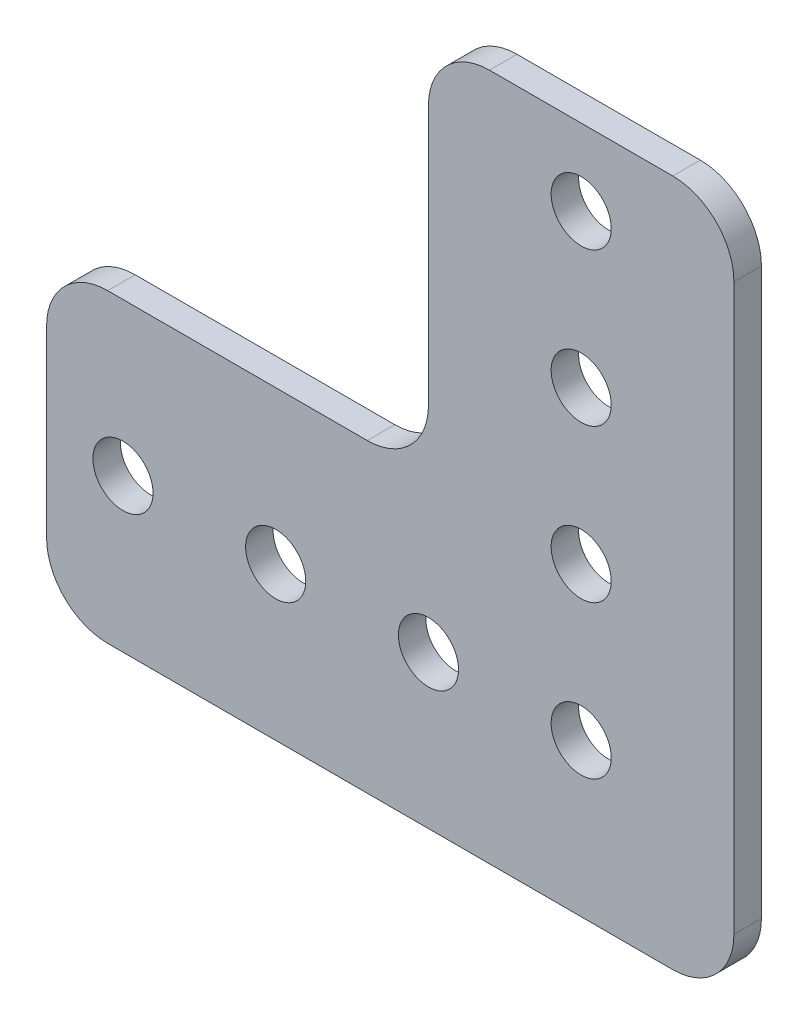
ISO-10303-21;
HEADER;
FILE_DESCRIPTION(('STEP AP214'),'2;1');
FILE_NAME('part.step','',(''),(''),'','','');
FILE_SCHEMA(('AUTOMOTIVE_DESIGN { 1 0 10303 214 1 1 1 1 }'));
ENDSEC;
DATA;
#1=APPLICATION_CONTEXT('core data for automotive mechanical design processes');
#2=APPLICATION_PROTOCOL_DEFINITION('international standard','automotive_design',2000,#1);
#3=PRODUCT_CONTEXT('',#1,'mechanical');
#4=PRODUCT('Part','Part','',(#3));
#5=PRODUCT_RELATED_PRODUCT_CATEGORY('part','',(#4));
#6=PRODUCT_DEFINITION_FORMATION('','',#4);
#7=PRODUCT_DEFINITION_CONTEXT('part definition',#1,'design');
#8=PRODUCT_DEFINITION('design','',#6,#7);
#9=PRODUCT_DEFINITION_SHAPE('','',#8);
#10=(LENGTH_UNIT() NAMED_UNIT(*) SI_UNIT(.MILLI.,.METRE.));
#11=(NAMED_UNIT(*) PLANE_ANGLE_UNIT() SI_UNIT($,.RADIAN.));
#12=(NAMED_UNIT(*) SI_UNIT($,.STERADIAN.) SOLID_ANGLE_UNIT());
#13=UNCERTAINTY_MEASURE_WITH_UNIT(LENGTH_MEASURE(1.E-05),#10,'distance_accuracy_value','');
#14=(GEOMETRIC_REPRESENTATION_CONTEXT(3) GLOBAL_UNCERTAINTY_ASSIGNED_CONTEXT((#13)) GLOBAL_UNIT_ASSIGNED_CONTEXT((#10,
#11,#12)) REPRESENTATION_CONTEXT('',''));
#15=CARTESIAN_POINT('',(0.,0.,0.));
#16=DIRECTION('',(0.,0.,1.));
#17=DIRECTION('',(1.,0.,0.));
#18=AXIS2_PLACEMENT_3D('',#15,#16,#17);
#19=CARTESIAN_POINT('',(7.62,572.77,2.286));
#20=DIRECTION('',(0.,0.,-1.));
#21=DIRECTION('',(-1.,0.,0.));
#22=AXIS2_PLACEMENT_3D('',#19,#20,#21);
#23=PLANE('',#22);
#24=CARTESIAN_POINT('',(7.62,572.77,2.286));
#25=DIRECTION('',(0.,0.,1.));
#26=DIRECTION('',(-1.,0.,0.));
#27=AXIS2_PLACEMENT_3D('',#24,#25,#26);
#28=CIRCLE('',#27,5.07999999999999);
#29=CARTESIAN_POINT('',(12.7,572.77,2.286));
#30=VERTEX_POINT('',#29);
#31=CARTESIAN_POINT('',(7.61999999999996,577.85,2.286));
#32=VERTEX_POINT('',#31);
#33=EDGE_CURVE('E179',#30,#32,#28,.T.);
#34=ORIENTED_EDGE('',*,*,#33,.T.);
#35=DIRECTION('',(-1.,0.,0.));
#36=VECTOR('',#35,1.);
#37=CARTESIAN_POINT('',(7.61999999999996,577.85,2.286));
#38=LINE('',#37,#36);
#39=CARTESIAN_POINT('',(-7.61999999999995,577.85,2.286));
#40=VERTEX_POINT('',#39);
#41=EDGE_CURVE('E107',#32,#40,#38,.T.);
#42=ORIENTED_EDGE('',*,*,#41,.T.);
#43=CARTESIAN_POINT('',(-7.61999999999999,572.77,2.286));
#44=DIRECTION('',(0.,0.,1.));
#45=DIRECTION('',(1.,0.,0.));
#46=AXIS2_PLACEMENT_3D('',#43,#44,#45);
#47=CIRCLE('',#46,5.07999999999999);
#48=CARTESIAN_POINT('',(-12.7,572.77,2.286));
#49=VERTEX_POINT('',#48);
#50=EDGE_CURVE('E206',#40,#49,#47,.T.);
#51=ORIENTED_EDGE('',*,*,#50,.T.);
#52=DIRECTION('',(0.,-1.,0.));
#53=VECTOR('',#52,1.);
#54=CARTESIAN_POINT('',(-12.7,572.77,2.286));
#55=LINE('',#54,#53);
#56=CARTESIAN_POINT('',(-12.6999999999999,551.18,2.286));
#57=VERTEX_POINT('',#56);
#58=EDGE_CURVE('E225',#49,#57,#55,.T.);
#59=ORIENTED_EDGE('',*,*,#58,.T.);
#60=CARTESIAN_POINT('',(-17.7799999999999,551.18,2.286));
#61=DIRECTION('',(0.,0.,-1.));
#62=DIRECTION('',(-1.,0.,0.));
#63=AXIS2_PLACEMENT_3D('',#60,#61,#62);
#64=CIRCLE('',#63,5.07999999999999);
#65=CARTESIAN_POINT('',(-17.78,546.1,2.286));
#66=VERTEX_POINT('',#65);
#67=EDGE_CURVE('E222',#57,#66,#64,.T.);
#68=ORIENTED_EDGE('',*,*,#67,.T.);
#69=DIRECTION('',(-1.,0.,0.));
#70=VECTOR('',#69,1.);
#71=CARTESIAN_POINT('',(-17.78,546.1,2.286));
#72=LINE('',#71,#70);
#73=CARTESIAN_POINT('',(-39.37,546.1,2.286));
#74=VERTEX_POINT('',#73);
#75=EDGE_CURVE('E224',#66,#74,#72,.T.);
#76=ORIENTED_EDGE('',*,*,#75,.T.);
#77=CARTESIAN_POINT('',(-39.37,541.02,2.286));
#78=DIRECTION('',(0.,0.,1.));
#79=DIRECTION('',(1.,0.,0.));
#80=AXIS2_PLACEMENT_3D('',#77,#78,#79);
#81=CIRCLE('',#80,5.07999999999999);
#82=CARTESIAN_POINT('',(-44.45,541.02,2.286));
#83=VERTEX_POINT('',#82);
#84=EDGE_CURVE('E227',#74,#83,#81,.T.);
#85=ORIENTED_EDGE('',*,*,#84,.T.);
#86=DIRECTION('',(0.,-1.,0.));
#87=VECTOR('',#86,1.);
#88=CARTESIAN_POINT('',(-44.45,541.02,2.286));
#89=LINE('',#88,#87);
#90=CARTESIAN_POINT('',(-44.45,525.78,2.286));
#91=VERTEX_POINT('',#90);
#92=EDGE_CURVE('E233',#83,#91,#89,.T.);
#93=ORIENTED_EDGE('',*,*,#92,.T.);
#94=CARTESIAN_POINT('',(-39.37,525.78,2.286));
#95=DIRECTION('',(0.,0.,1.));
#96=DIRECTION('',(1.,0.,0.));
#97=AXIS2_PLACEMENT_3D('',#94,#95,#96);
#98=CIRCLE('',#97,5.07999999999999);
#99=CARTESIAN_POINT('',(-39.37,520.7,2.286));
#100=VERTEX_POINT('',#99);
#101=EDGE_CURVE('E138',#91,#100,#98,.T.);
#102=ORIENTED_EDGE('',*,*,#101,.T.);
#103=DIRECTION('',(1.,0.,0.));
#104=VECTOR('',#103,1.);
#105=CARTESIAN_POINT('',(-39.37,520.7,2.286));
#106=LINE('',#105,#104);
#107=CARTESIAN_POINT('',(7.61999999999996,520.7,2.286));
#108=VERTEX_POINT('',#107);
#109=EDGE_CURVE('E132',#100,#108,#106,.T.);
#110=ORIENTED_EDGE('',*,*,#109,.T.);
#111=CARTESIAN_POINT('',(7.62,525.78,2.286));
#112=DIRECTION('',(0.,0.,1.));
#113=DIRECTION('',(1.,0.,0.));
#114=AXIS2_PLACEMENT_3D('',#111,#112,#113);
#115=CIRCLE('',#114,5.07999999999999);
#116=CARTESIAN_POINT('',(12.7,525.78,2.286));
#117=VERTEX_POINT('',#116);
#118=EDGE_CURVE('E136',#108,#117,#115,.T.);
#119=ORIENTED_EDGE('',*,*,#118,.T.);
#120=DIRECTION('',(0.,1.,0.));
#121=VECTOR('',#120,1.);
#122=CARTESIAN_POINT('',(12.7,525.78,2.286));
#123=LINE('',#122,#121);
#124=EDGE_CURVE('E52',#117,#30,#123,.T.);
#125=ORIENTED_EDGE('',*,*,#124,.T.);
#126=EDGE_LOOP('',(#34,#42,#51,#59,#68,#76,#85,#93,#102,#110,#119,#125));
#127=FACE_BOUND('',#126,.T.);
#128=CARTESIAN_POINT('',(0.,533.4,2.286));
#129=DIRECTION('',(0.,0.,1.));
#130=DIRECTION('',(1.,0.,0.));
#131=AXIS2_PLACEMENT_3D('',#128,#129,#130);
#132=CIRCLE('',#131,2.49999999999976);
#133=CARTESIAN_POINT('',(2.49999999999976,533.4,2.286));
#134=VERTEX_POINT('',#133);
#135=EDGE_CURVE('E160',#134,#134,#132,.T.);
#136=ORIENTED_EDGE('',*,*,#135,.F.);
#137=EDGE_LOOP('',(#136));
#138=FACE_BOUND('',#137,.T.);
#139=CARTESIAN_POINT('',(-12.7,533.4,2.286));
#140=DIRECTION('',(0.,0.,1.));
#141=DIRECTION('',(1.,0.,0.));
#142=AXIS2_PLACEMENT_3D('',#139,#140,#141);
#143=CIRCLE('',#142,2.49999999999976);
#144=CARTESIAN_POINT('',(-10.2000000000002,533.4,2.286));
#145=VERTEX_POINT('',#144);
#146=EDGE_CURVE('E327',#145,#145,#143,.T.);
#147=ORIENTED_EDGE('',*,*,#146,.F.);
#148=EDGE_LOOP('',(#147));
#149=FACE_BOUND('',#148,.T.);
#150=CARTESIAN_POINT('',(-25.4,533.4,2.286));
#151=DIRECTION('',(0.,0.,1.));
#152=DIRECTION('',(1.,0.,0.));
#153=AXIS2_PLACEMENT_3D('',#150,#151,#152);
#154=CIRCLE('',#153,2.49999999999976);
#155=CARTESIAN_POINT('',(-22.9000000000002,533.4,2.286));
#156=VERTEX_POINT('',#155);
#157=EDGE_CURVE('E321',#156,#156,#154,.T.);
#158=ORIENTED_EDGE('',*,*,#157,.F.);
#159=EDGE_LOOP('',(#158));
#160=FACE_BOUND('',#159,.T.);
#161=CARTESIAN_POINT('',(-38.1,533.4,2.286));
#162=DIRECTION('',(0.,0.,1.));
#163=DIRECTION('',(1.,0.,0.));
#164=AXIS2_PLACEMENT_3D('',#161,#162,#163);
#165=CIRCLE('',#164,2.49999999999976);
#166=CARTESIAN_POINT('',(-35.6000000000002,533.4,2.286));
#167=VERTEX_POINT('',#166);
#168=EDGE_CURVE('E315',#167,#167,#165,.T.);
#169=ORIENTED_EDGE('',*,*,#168,.F.);
#170=EDGE_LOOP('',(#169));
#171=FACE_BOUND('',#170,.T.);
#172=CARTESIAN_POINT('',(0.,546.1,2.286));
#173=DIRECTION('',(0.,0.,1.));
#174=DIRECTION('',(1.,0.,0.));
#175=AXIS2_PLACEMENT_3D('',#172,#173,#174);
#176=CIRCLE('',#175,2.49999999999976);
#177=CARTESIAN_POINT('',(2.49999999999976,546.1,2.286));
#178=VERTEX_POINT('',#177);
#179=EDGE_CURVE('E309',#178,#178,#176,.T.);
#180=ORIENTED_EDGE('',*,*,#179,.F.);
#181=EDGE_LOOP('',(#180));
#182=FACE_BOUND('',#181,.T.);
#183=CARTESIAN_POINT('',(0.,558.8,2.286));
#184=DIRECTION('',(0.,0.,1.));
#185=DIRECTION('',(1.,0.,0.));
#186=AXIS2_PLACEMENT_3D('',#183,#184,#185);
#187=CIRCLE('',#186,2.49999999999976);
#188=CARTESIAN_POINT('',(2.49999999999976,558.8,2.286));
#189=VERTEX_POINT('',#188);
#190=EDGE_CURVE('E303',#189,#189,#187,.T.);
#191=ORIENTED_EDGE('',*,*,#190,.F.);
#192=EDGE_LOOP('',(#191));
#193=FACE_BOUND('',#192,.T.);
#194=CARTESIAN_POINT('',(0.,571.5,2.286));
#195=DIRECTION('',(0.,0.,1.));
#196=DIRECTION('',(1.,0.,0.));
#197=AXIS2_PLACEMENT_3D('',#194,#195,#196);
#198=CIRCLE('',#197,2.49999999999976);
#199=CARTESIAN_POINT('',(2.49999999999976,571.5,2.286));
#200=VERTEX_POINT('',#199);
#201=EDGE_CURVE('E294',#200,#200,#198,.T.);
#202=ORIENTED_EDGE('',*,*,#201,.F.);
#203=EDGE_LOOP('',(#202));
#204=FACE_BOUND('',#203,.T.);
#205=ADVANCED_FACE('F35',(#127,#138,#149,#160,#171,#182,#193,#204),#23,.F.);
#206=CARTESIAN_POINT('',(7.62,572.77,0.));
#207=DIRECTION('',(0.,0.,-1.));
#208=DIRECTION('',(-1.,0.,0.));
#209=AXIS2_PLACEMENT_3D('',#206,#207,#208);
#210=PLANE('',#209);
#211=CARTESIAN_POINT('',(0.,558.8,0.));
#212=DIRECTION('',(0.,0.,1.));
#213=DIRECTION('',(1.,0.,0.));
#214=AXIS2_PLACEMENT_3D('',#211,#212,#213);
#215=CIRCLE('',#214,2.49999999999976);
#216=CARTESIAN_POINT('',(2.49999999999976,558.8,0.));
#217=VERTEX_POINT('',#216);
#218=EDGE_CURVE('E300',#217,#217,#215,.T.);
#219=ORIENTED_EDGE('',*,*,#218,.T.);
#220=EDGE_LOOP('',(#219));
#221=FACE_BOUND('',#220,.T.);
#222=CARTESIAN_POINT('',(-38.1,533.4,0.));
#223=DIRECTION('',(0.,0.,1.));
#224=DIRECTION('',(1.,0.,0.));
#225=AXIS2_PLACEMENT_3D('',#222,#223,#224);
#226=CIRCLE('',#225,2.49999999999976);
#227=CARTESIAN_POINT('',(-35.6000000000002,533.4,0.));
#228=VERTEX_POINT('',#227);
#229=EDGE_CURVE('E312',#228,#228,#226,.T.);
#230=ORIENTED_EDGE('',*,*,#229,.T.);
#231=EDGE_LOOP('',(#230));
#232=FACE_BOUND('',#231,.T.);
#233=CARTESIAN_POINT('',(-12.7,533.4,0.));
#234=DIRECTION('',(0.,0.,1.));
#235=DIRECTION('',(1.,0.,0.));
#236=AXIS2_PLACEMENT_3D('',#233,#234,#235);
#237=CIRCLE('',#236,2.49999999999976);
#238=CARTESIAN_POINT('',(-10.2000000000002,533.4,0.));
#239=VERTEX_POINT('',#238);
#240=EDGE_CURVE('E324',#239,#239,#237,.T.);
#241=ORIENTED_EDGE('',*,*,#240,.T.);
#242=EDGE_LOOP('',(#241));
#243=FACE_BOUND('',#242,.T.);
#244=CARTESIAN_POINT('',(7.62,572.77,0.));
#245=DIRECTION('',(0.,0.,1.));
#246=DIRECTION('',(-1.,0.,0.));
#247=AXIS2_PLACEMENT_3D('',#244,#245,#246);
#248=CIRCLE('',#247,5.07999999999999);
#249=CARTESIAN_POINT('',(12.7,572.77,0.));
#250=VERTEX_POINT('',#249);
#251=CARTESIAN_POINT('',(7.61999999999996,577.85,0.));
#252=VERTEX_POINT('',#251);
#253=EDGE_CURVE('E156',#250,#252,#248,.T.);
#254=ORIENTED_EDGE('',*,*,#253,.F.);
#255=DIRECTION('',(0.,1.,0.));
#256=VECTOR('',#255,1.);
#257=CARTESIAN_POINT('',(12.7,525.78,0.));
#258=LINE('',#257,#256);
#259=CARTESIAN_POINT('',(12.7,525.78,0.));
#260=VERTEX_POINT('',#259);
#261=EDGE_CURVE('E99',#260,#250,#258,.T.);
#262=ORIENTED_EDGE('',*,*,#261,.F.);
#263=CARTESIAN_POINT('',(7.62,525.78,0.));
#264=DIRECTION('',(0.,0.,1.));
#265=DIRECTION('',(1.,0.,0.));
#266=AXIS2_PLACEMENT_3D('',#263,#264,#265);
#267=CIRCLE('',#266,5.07999999999999);
#268=CARTESIAN_POINT('',(7.61999999999996,520.7,0.));
#269=VERTEX_POINT('',#268);
#270=EDGE_CURVE('E93',#269,#260,#267,.T.);
#271=ORIENTED_EDGE('',*,*,#270,.F.);
#272=DIRECTION('',(1.,0.,0.));
#273=VECTOR('',#272,1.);
#274=CARTESIAN_POINT('',(-39.37,520.7,0.));
#275=LINE('',#274,#273);
#276=CARTESIAN_POINT('',(-39.37,520.7,0.));
#277=VERTEX_POINT('',#276);
#278=EDGE_CURVE('E146',#277,#269,#275,.T.);
#279=ORIENTED_EDGE('',*,*,#278,.F.);
#280=CARTESIAN_POINT('',(-39.37,525.78,0.));
#281=DIRECTION('',(0.,0.,1.));
#282=DIRECTION('',(1.,0.,0.));
#283=AXIS2_PLACEMENT_3D('',#280,#281,#282);
#284=CIRCLE('',#283,5.07999999999999);
#285=CARTESIAN_POINT('',(-44.45,525.78,0.));
#286=VERTEX_POINT('',#285);
#287=EDGE_CURVE('E174',#286,#277,#284,.T.);
#288=ORIENTED_EDGE('',*,*,#287,.F.);
#289=DIRECTION('',(0.,-1.,0.));
#290=VECTOR('',#289,1.);
#291=CARTESIAN_POINT('',(-44.45,541.02,0.));
#292=LINE('',#291,#290);
#293=CARTESIAN_POINT('',(-44.45,541.02,0.));
#294=VERTEX_POINT('',#293);
#295=EDGE_CURVE('E172',#294,#286,#292,.T.);
#296=ORIENTED_EDGE('',*,*,#295,.F.);
#297=CARTESIAN_POINT('',(-39.37,541.02,0.));
#298=DIRECTION('',(0.,0.,1.));
#299=DIRECTION('',(1.,0.,0.));
#300=AXIS2_PLACEMENT_3D('',#297,#298,#299);
#301=CIRCLE('',#300,5.07999999999999);
#302=CARTESIAN_POINT('',(-39.37,546.1,0.));
#303=VERTEX_POINT('',#302);
#304=EDGE_CURVE('E170',#303,#294,#301,.T.);
#305=ORIENTED_EDGE('',*,*,#304,.F.);
#306=DIRECTION('',(-1.,0.,0.));
#307=VECTOR('',#306,1.);
#308=CARTESIAN_POINT('',(-17.78,546.1,0.));
#309=LINE('',#308,#307);
#310=CARTESIAN_POINT('',(-17.78,546.1,0.));
#311=VERTEX_POINT('',#310);
#312=EDGE_CURVE('E168',#311,#303,#309,.T.);
#313=ORIENTED_EDGE('',*,*,#312,.F.);
#314=CARTESIAN_POINT('',(-17.7799999999999,551.18,0.));
#315=DIRECTION('',(0.,0.,-1.));
#316=DIRECTION('',(-1.,0.,0.));
#317=AXIS2_PLACEMENT_3D('',#314,#315,#316);
#318=CIRCLE('',#317,5.07999999999999);
#319=CARTESIAN_POINT('',(-12.6999999999999,551.18,0.));
#320=VERTEX_POINT('',#319);
#321=EDGE_CURVE('E166',#320,#311,#318,.T.);
#322=ORIENTED_EDGE('',*,*,#321,.F.);
#323=DIRECTION('',(0.,-1.,0.));
#324=VECTOR('',#323,1.);
#325=CARTESIAN_POINT('',(-12.7,572.77,0.));
#326=LINE('',#325,#324);
#327=CARTESIAN_POINT('',(-12.7,572.77,0.));
#328=VERTEX_POINT('',#327);
#329=EDGE_CURVE('E164',#328,#320,#326,.T.);
#330=ORIENTED_EDGE('',*,*,#329,.F.);
#331=CARTESIAN_POINT('',(-7.61999999999999,572.77,0.));
#332=DIRECTION('',(0.,0.,1.));
#333=DIRECTION('',(1.,0.,0.));
#334=AXIS2_PLACEMENT_3D('',#331,#332,#333);
#335=CIRCLE('',#334,5.07999999999999);
#336=CARTESIAN_POINT('',(-7.61999999999995,577.85,0.));
#337=VERTEX_POINT('',#336);
#338=EDGE_CURVE('E162',#337,#328,#335,.T.);
#339=ORIENTED_EDGE('',*,*,#338,.F.);
#340=DIRECTION('',(-1.,0.,0.));
#341=VECTOR('',#340,1.);
#342=CARTESIAN_POINT('',(7.61999999999996,577.85,0.));
#343=LINE('',#342,#341);
#344=EDGE_CURVE('E159',#252,#337,#343,.T.);
#345=ORIENTED_EDGE('',*,*,#344,.F.);
#346=EDGE_LOOP('',(#254,#262,#271,#279,#288,#296,#305,#313,#322,#330,#339,#345));
#347=FACE_BOUND('',#346,.T.);
#348=CARTESIAN_POINT('',(0.,533.4,0.));
#349=DIRECTION('',(0.,0.,1.));
#350=DIRECTION('',(1.,0.,0.));
#351=AXIS2_PLACEMENT_3D('',#348,#349,#350);
#352=CIRCLE('',#351,2.49999999999976);
#353=CARTESIAN_POINT('',(2.49999999999976,533.4,0.));
#354=VERTEX_POINT('',#353);
#355=EDGE_CURVE('E330',#354,#354,#352,.T.);
#356=ORIENTED_EDGE('',*,*,#355,.T.);
#357=EDGE_LOOP('',(#356));
#358=FACE_BOUND('',#357,.T.);
#359=CARTESIAN_POINT('',(-25.4,533.4,0.));
#360=DIRECTION('',(0.,0.,1.));
#361=DIRECTION('',(1.,0.,0.));
#362=AXIS2_PLACEMENT_3D('',#359,#360,#361);
#363=CIRCLE('',#362,2.49999999999976);
#364=CARTESIAN_POINT('',(-22.9000000000002,533.4,0.));
#365=VERTEX_POINT('',#364);
#366=EDGE_CURVE('E318',#365,#365,#363,.T.);
#367=ORIENTED_EDGE('',*,*,#366,.T.);
#368=EDGE_LOOP('',(#367));
#369=FACE_BOUND('',#368,.T.);
#370=CARTESIAN_POINT('',(0.,546.1,0.));
#371=DIRECTION('',(0.,0.,1.));
#372=DIRECTION('',(1.,0.,0.));
#373=AXIS2_PLACEMENT_3D('',#370,#371,#372);
#374=CIRCLE('',#373,2.49999999999976);
#375=CARTESIAN_POINT('',(2.49999999999976,546.1,0.));
#376=VERTEX_POINT('',#375);
#377=EDGE_CURVE('E306',#376,#376,#374,.T.);
#378=ORIENTED_EDGE('',*,*,#377,.T.);
#379=EDGE_LOOP('',(#378));
#380=FACE_BOUND('',#379,.T.);
#381=CARTESIAN_POINT('',(0.,571.5,0.));
#382=DIRECTION('',(0.,0.,1.));
#383=DIRECTION('',(1.,0.,0.));
#384=AXIS2_PLACEMENT_3D('',#381,#382,#383);
#385=CIRCLE('',#384,2.49999999999976);
#386=CARTESIAN_POINT('',(2.49999999999976,571.5,0.));
#387=VERTEX_POINT('',#386);
#388=EDGE_CURVE('E297',#387,#387,#385,.T.);
#389=ORIENTED_EDGE('',*,*,#388,.T.);
#390=EDGE_LOOP('',(#389));
#391=FACE_BOUND('',#390,.T.);
#392=ADVANCED_FACE('F210',(#221,#232,#243,#347,#358,#369,#380,#391),#210,.T.);
#393=CARTESIAN_POINT('',(7.62,572.77,2.286));
#394=DIRECTION('',(0.,0.,-1.));
#395=DIRECTION('',(-1.,0.,0.));
#396=AXIS2_PLACEMENT_3D('',#393,#394,#395);
#397=CYLINDRICAL_SURFACE('',#396,5.07999999999999);
#398=ORIENTED_EDGE('',*,*,#253,.T.);
#399=DIRECTION('',(0.,0.,-1.));
#400=VECTOR('',#399,1.);
#401=CARTESIAN_POINT('',(7.61999999999996,577.85,2.286));
#402=LINE('',#401,#400);
#403=EDGE_CURVE('E11',#32,#252,#402,.T.);
#404=ORIENTED_EDGE('',*,*,#403,.F.);
#405=ORIENTED_EDGE('',*,*,#33,.F.);
#406=DIRECTION('',(0.,0.,-1.));
#407=VECTOR('',#406,1.);
#408=CARTESIAN_POINT('',(12.7,572.77,2.286));
#409=LINE('',#408,#407);
#410=EDGE_CURVE('E152',#30,#250,#409,.T.);
#411=ORIENTED_EDGE('',*,*,#410,.T.);
#412=EDGE_LOOP('',(#398,#404,#405,#411));
#413=FACE_BOUND('',#412,.T.);
#414=ADVANCED_FACE('F37',(#413),#397,.T.);
#415=CARTESIAN_POINT('',(7.61999999999996,577.85,2.286));
#416=DIRECTION('',(0.,-1.,0.));
#417=DIRECTION('',(0.,0.,-1.));
#418=AXIS2_PLACEMENT_3D('',#415,#416,#417);
#419=PLANE('',#418);
#420=ORIENTED_EDGE('',*,*,#344,.T.);
#421=DIRECTION('',(0.,0.,-1.));
#422=VECTOR('',#421,1.);
#423=CARTESIAN_POINT('',(-7.61999999999995,577.85,2.286));
#424=LINE('',#423,#422);
#425=EDGE_CURVE('E44',#40,#337,#424,.T.);
#426=ORIENTED_EDGE('',*,*,#425,.F.);
#427=ORIENTED_EDGE('',*,*,#41,.F.);
#428=ORIENTED_EDGE('',*,*,#403,.T.);
#429=EDGE_LOOP('',(#420,#426,#427,#428));
#430=FACE_BOUND('',#429,.T.);
#431=ADVANCED_FACE('F469',(#430),#419,.F.);
#432=CARTESIAN_POINT('',(-7.61999999999999,572.77,2.286));
#433=DIRECTION('',(0.,0.,-1.));
#434=DIRECTION('',(-1.,0.,0.));
#435=AXIS2_PLACEMENT_3D('',#432,#433,#434);
#436=CYLINDRICAL_SURFACE('',#435,5.07999999999999);
#437=ORIENTED_EDGE('',*,*,#338,.T.);
#438=DIRECTION('',(0.,0.,-1.));
#439=VECTOR('',#438,1.);
#440=CARTESIAN_POINT('',(-12.7,572.77,2.286));
#441=LINE('',#440,#439);
#442=EDGE_CURVE('E198',#49,#328,#441,.T.);
#443=ORIENTED_EDGE('',*,*,#442,.F.);
#444=ORIENTED_EDGE('',*,*,#50,.F.);
#445=ORIENTED_EDGE('',*,*,#425,.T.);
#446=EDGE_LOOP('',(#437,#443,#444,#445));
#447=FACE_BOUND('',#446,.T.);
#448=ADVANCED_FACE('F204',(#447),#436,.T.);
#449=CARTESIAN_POINT('',(-12.7,572.77,2.286));
#450=DIRECTION('',(1.,0.,0.));
#451=DIRECTION('',(0.,1.,0.));
#452=AXIS2_PLACEMENT_3D('',#449,#450,#451);
#453=PLANE('',#452);
#454=ORIENTED_EDGE('',*,*,#329,.T.);
#455=DIRECTION('',(0.,0.,-1.));
#456=VECTOR('',#455,1.);
#457=CARTESIAN_POINT('',(-12.6999999999999,551.18,2.286));
#458=LINE('',#457,#456);
#459=EDGE_CURVE('E195',#57,#320,#458,.T.);
#460=ORIENTED_EDGE('',*,*,#459,.F.);
#461=ORIENTED_EDGE('',*,*,#58,.F.);
#462=ORIENTED_EDGE('',*,*,#442,.T.);
#463=EDGE_LOOP('',(#454,#460,#461,#462));
#464=FACE_BOUND('',#463,.T.);
#465=ADVANCED_FACE('F216',(#464),#453,.F.);
#466=CARTESIAN_POINT('',(-17.7799999999999,551.18,2.286));
#467=DIRECTION('',(0.,0.,-1.));
#468=DIRECTION('',(-1.,0.,0.));
#469=AXIS2_PLACEMENT_3D('',#466,#467,#468);
#470=CYLINDRICAL_SURFACE('',#469,5.07999999999999);
#471=ORIENTED_EDGE('',*,*,#321,.T.);
#472=DIRECTION('',(0.,0.,-1.));
#473=VECTOR('',#472,1.);
#474=CARTESIAN_POINT('',(-17.78,546.1,2.286));
#475=LINE('',#474,#473);
#476=EDGE_CURVE('E192',#66,#311,#475,.T.);
#477=ORIENTED_EDGE('',*,*,#476,.F.);
#478=ORIENTED_EDGE('',*,*,#67,.F.);
#479=ORIENTED_EDGE('',*,*,#459,.T.);
#480=EDGE_LOOP('',(#471,#477,#478,#479));
#481=FACE_BOUND('',#480,.T.);
#482=ADVANCED_FACE('F220',(#481),#470,.F.);
#483=CARTESIAN_POINT('',(-17.78,546.1,2.286));
#484=DIRECTION('',(0.,-1.,0.));
#485=DIRECTION('',(0.,0.,-1.));
#486=AXIS2_PLACEMENT_3D('',#483,#484,#485);
#487=PLANE('',#486);
#488=ORIENTED_EDGE('',*,*,#312,.T.);
#489=DIRECTION('',(0.,0.,-1.));
#490=VECTOR('',#489,1.);
#491=CARTESIAN_POINT('',(-39.37,546.1,2.286));
#492=LINE('',#491,#490);
#493=EDGE_CURVE('E189',#74,#303,#492,.T.);
#494=ORIENTED_EDGE('',*,*,#493,.F.);
#495=ORIENTED_EDGE('',*,*,#75,.F.);
#496=ORIENTED_EDGE('',*,*,#476,.T.);
#497=EDGE_LOOP('',(#488,#494,#495,#496));
#498=FACE_BOUND('',#497,.T.);
#499=ADVANCED_FACE('F434',(#498),#487,.F.);
#500=CARTESIAN_POINT('',(-39.37,541.02,2.286));
#501=DIRECTION('',(0.,0.,-1.));
#502=DIRECTION('',(-1.,0.,0.));
#503=AXIS2_PLACEMENT_3D('',#500,#501,#502);
#504=CYLINDRICAL_SURFACE('',#503,5.07999999999999);
#505=ORIENTED_EDGE('',*,*,#304,.T.);
#506=DIRECTION('',(0.,0.,-1.));
#507=VECTOR('',#506,1.);
#508=CARTESIAN_POINT('',(-44.45,541.02,2.286));
#509=LINE('',#508,#507);
#510=EDGE_CURVE('E186',#83,#294,#509,.T.);
#511=ORIENTED_EDGE('',*,*,#510,.F.);
#512=ORIENTED_EDGE('',*,*,#84,.F.);
#513=ORIENTED_EDGE('',*,*,#493,.T.);
#514=EDGE_LOOP('',(#505,#511,#512,#513));
#515=FACE_BOUND('',#514,.T.);
#516=ADVANCED_FACE('F425',(#515),#504,.T.);
#517=CARTESIAN_POINT('',(-44.45,541.02,2.286));
#518=DIRECTION('',(1.,0.,0.));
#519=DIRECTION('',(0.,1.,0.));
#520=AXIS2_PLACEMENT_3D('',#517,#518,#519);
#521=PLANE('',#520);
#522=ORIENTED_EDGE('',*,*,#295,.T.);
#523=DIRECTION('',(0.,0.,-1.));
#524=VECTOR('',#523,1.);
#525=CARTESIAN_POINT('',(-44.45,525.78,2.286));
#526=LINE('',#525,#524);
#527=EDGE_CURVE('E183',#91,#286,#526,.T.);
#528=ORIENTED_EDGE('',*,*,#527,.F.);
#529=ORIENTED_EDGE('',*,*,#92,.F.);
#530=ORIENTED_EDGE('',*,*,#510,.T.);
#531=EDGE_LOOP('',(#522,#528,#529,#530));
#532=FACE_BOUND('',#531,.T.);
#533=ADVANCED_FACE('F239',(#532),#521,.F.);
#534=CARTESIAN_POINT('',(-39.37,525.78,2.286));
#535=DIRECTION('',(0.,0.,-1.));
#536=DIRECTION('',(-1.,0.,0.));
#537=AXIS2_PLACEMENT_3D('',#534,#535,#536);
#538=CYLINDRICAL_SURFACE('',#537,5.07999999999999);
#539=ORIENTED_EDGE('',*,*,#287,.T.);
#540=DIRECTION('',(0.,0.,-1.));
#541=VECTOR('',#540,1.);
#542=CARTESIAN_POINT('',(-39.37,520.7,2.286));
#543=LINE('',#542,#541);
#544=EDGE_CURVE('E147',#100,#277,#543,.T.);
#545=ORIENTED_EDGE('',*,*,#544,.F.);
#546=ORIENTED_EDGE('',*,*,#101,.F.);
#547=ORIENTED_EDGE('',*,*,#527,.T.);
#548=EDGE_LOOP('',(#539,#545,#546,#547));
#549=FACE_BOUND('',#548,.T.);
#550=ADVANCED_FACE('F243',(#549),#538,.T.);
#551=CARTESIAN_POINT('',(-39.37,520.7,2.286));
#552=DIRECTION('',(0.,1.,0.));
#553=DIRECTION('',(0.,0.,1.));
#554=AXIS2_PLACEMENT_3D('',#551,#552,#553);
#555=PLANE('',#554);
#556=ORIENTED_EDGE('',*,*,#278,.T.);
#557=DIRECTION('',(0.,0.,-1.));
#558=VECTOR('',#557,1.);
#559=CARTESIAN_POINT('',(7.61999999999996,520.7,2.286));
#560=LINE('',#559,#558);
#561=EDGE_CURVE('E143',#108,#269,#560,.T.);
#562=ORIENTED_EDGE('',*,*,#561,.F.);
#563=ORIENTED_EDGE('',*,*,#109,.F.);
#564=ORIENTED_EDGE('',*,*,#544,.T.);
#565=EDGE_LOOP('',(#556,#562,#563,#564));
#566=FACE_BOUND('',#565,.T.);
#567=ADVANCED_FACE('F144',(#566),#555,.F.);
#568=CARTESIAN_POINT('',(7.62,525.78,2.286));
#569=DIRECTION('',(0.,0.,-1.));
#570=DIRECTION('',(-1.,0.,0.));
#571=AXIS2_PLACEMENT_3D('',#568,#569,#570);
#572=CYLINDRICAL_SURFACE('',#571,5.07999999999999);
#573=ORIENTED_EDGE('',*,*,#270,.T.);
#574=DIRECTION('',(0.,0.,-1.));
#575=VECTOR('',#574,1.);
#576=CARTESIAN_POINT('',(12.7,525.78,2.286));
#577=LINE('',#576,#575);
#578=EDGE_CURVE('E148',#117,#260,#577,.T.);
#579=ORIENTED_EDGE('',*,*,#578,.F.);
#580=ORIENTED_EDGE('',*,*,#118,.F.);
#581=ORIENTED_EDGE('',*,*,#561,.T.);
#582=EDGE_LOOP('',(#573,#579,#580,#581));
#583=FACE_BOUND('',#582,.T.);
#584=ADVANCED_FACE('F150',(#583),#572,.T.);
#585=CARTESIAN_POINT('',(12.7,525.78,2.286));
#586=DIRECTION('',(-1.,0.,0.));
#587=DIRECTION('',(0.,0.,1.));
#588=AXIS2_PLACEMENT_3D('',#585,#586,#587);
#589=PLANE('',#588);
#590=ORIENTED_EDGE('',*,*,#261,.T.);
#591=ORIENTED_EDGE('',*,*,#410,.F.);
#592=ORIENTED_EDGE('',*,*,#124,.F.);
#593=ORIENTED_EDGE('',*,*,#578,.T.);
#594=EDGE_LOOP('',(#590,#591,#592,#593));
#595=FACE_BOUND('',#594,.T.);
#596=ADVANCED_FACE('F247',(#595),#589,.F.);
#597=CARTESIAN_POINT('',(0.,533.4,2.286));
#598=DIRECTION('',(0.,0.,-1.));
#599=DIRECTION('',(-1.,0.,0.));
#600=AXIS2_PLACEMENT_3D('',#597,#598,#599);
#601=CYLINDRICAL_SURFACE('',#600,2.49999999999976);
#602=ORIENTED_EDGE('',*,*,#135,.T.);
#603=EDGE_LOOP('',(#602));
#604=FACE_BOUND('',#603,.T.);
#605=ORIENTED_EDGE('',*,*,#355,.F.);
#606=EDGE_LOOP('',(#605));
#607=FACE_BOUND('',#606,.T.);
#608=ADVANCED_FACE('F249',(#604,#607),#601,.F.);
#609=CARTESIAN_POINT('',(-12.7,533.4,2.286));
#610=DIRECTION('',(0.,0.,-1.));
#611=DIRECTION('',(-1.,0.,0.));
#612=AXIS2_PLACEMENT_3D('',#609,#610,#611);
#613=CYLINDRICAL_SURFACE('',#612,2.49999999999976);
#614=ORIENTED_EDGE('',*,*,#146,.T.);
#615=EDGE_LOOP('',(#614));
#616=FACE_BOUND('',#615,.T.);
#617=ORIENTED_EDGE('',*,*,#240,.F.);
#618=EDGE_LOOP('',(#617));
#619=FACE_BOUND('',#618,.T.);
#620=ADVANCED_FACE('F255',(#616,#619),#613,.F.);
#621=CARTESIAN_POINT('',(-25.4,533.4,2.286));
#622=DIRECTION('',(0.,0.,-1.));
#623=DIRECTION('',(-1.,0.,0.));
#624=AXIS2_PLACEMENT_3D('',#621,#622,#623);
#625=CYLINDRICAL_SURFACE('',#624,2.49999999999976);
#626=ORIENTED_EDGE('',*,*,#157,.T.);
#627=EDGE_LOOP('',(#626));
#628=FACE_BOUND('',#627,.T.);
#629=ORIENTED_EDGE('',*,*,#366,.F.);
#630=EDGE_LOOP('',(#629));
#631=FACE_BOUND('',#630,.T.);
#632=ADVANCED_FACE('F269',(#628,#631),#625,.F.);
#633=CARTESIAN_POINT('',(-38.1,533.4,2.286));
#634=DIRECTION('',(0.,0.,-1.));
#635=DIRECTION('',(-1.,0.,0.));
#636=AXIS2_PLACEMENT_3D('',#633,#634,#635);
#637=CYLINDRICAL_SURFACE('',#636,2.49999999999976);
#638=ORIENTED_EDGE('',*,*,#168,.T.);
#639=EDGE_LOOP('',(#638));
#640=FACE_BOUND('',#639,.T.);
#641=ORIENTED_EDGE('',*,*,#229,.F.);
#642=EDGE_LOOP('',(#641));
#643=FACE_BOUND('',#642,.T.);
#644=ADVANCED_FACE('F273',(#640,#643),#637,.F.);
#645=CARTESIAN_POINT('',(0.,546.1,2.286));
#646=DIRECTION('',(0.,0.,-1.));
#647=DIRECTION('',(-1.,0.,0.));
#648=AXIS2_PLACEMENT_3D('',#645,#646,#647);
#649=CYLINDRICAL_SURFACE('',#648,2.49999999999976);
#650=ORIENTED_EDGE('',*,*,#179,.T.);
#651=EDGE_LOOP('',(#650));
#652=FACE_BOUND('',#651,.T.);
#653=ORIENTED_EDGE('',*,*,#377,.F.);
#654=EDGE_LOOP('',(#653));
#655=FACE_BOUND('',#654,.T.);
#656=ADVANCED_FACE('F277',(#652,#655),#649,.F.);
#657=CARTESIAN_POINT('',(0.,558.8,2.286));
#658=DIRECTION('',(0.,0.,-1.));
#659=DIRECTION('',(-1.,0.,0.));
#660=AXIS2_PLACEMENT_3D('',#657,#658,#659);
#661=CYLINDRICAL_SURFACE('',#660,2.49999999999976);
#662=ORIENTED_EDGE('',*,*,#190,.T.);
#663=EDGE_LOOP('',(#662));
#664=FACE_BOUND('',#663,.T.);
#665=ORIENTED_EDGE('',*,*,#218,.F.);
#666=EDGE_LOOP('',(#665));
#667=FACE_BOUND('',#666,.T.);
#668=ADVANCED_FACE('F281',(#664,#667),#661,.F.);
#669=CARTESIAN_POINT('',(0.,571.5,2.286));
#670=DIRECTION('',(0.,0.,-1.));
#671=DIRECTION('',(-1.,0.,0.));
#672=AXIS2_PLACEMENT_3D('',#669,#670,#671);
#673=CYLINDRICAL_SURFACE('',#672,2.49999999999976);
#674=ORIENTED_EDGE('',*,*,#201,.T.);
#675=EDGE_LOOP('',(#674));
#676=FACE_BOUND('',#675,.T.);
#677=ORIENTED_EDGE('',*,*,#388,.F.);
#678=EDGE_LOOP('',(#677));
#679=FACE_BOUND('',#678,.T.);
#680=ADVANCED_FACE('F285',(#676,#679),#673,.F.);
#681=CLOSED_SHELL('',(#205,#392,#414,#431,#448,#465,#482,#499,#516,#533,#550,#567,#584,#596,
#608,#620,#632,#644,#656,#668,#680));
#682=MANIFOLD_SOLID_BREP('B2',#681);
#683=ADVANCED_BREP_SHAPE_REPRESENTATION('',(#18,#682),#14);
#684=SHAPE_DEFINITION_REPRESENTATION(#9,#683);
ENDSEC;
END-ISO-10303-21;
